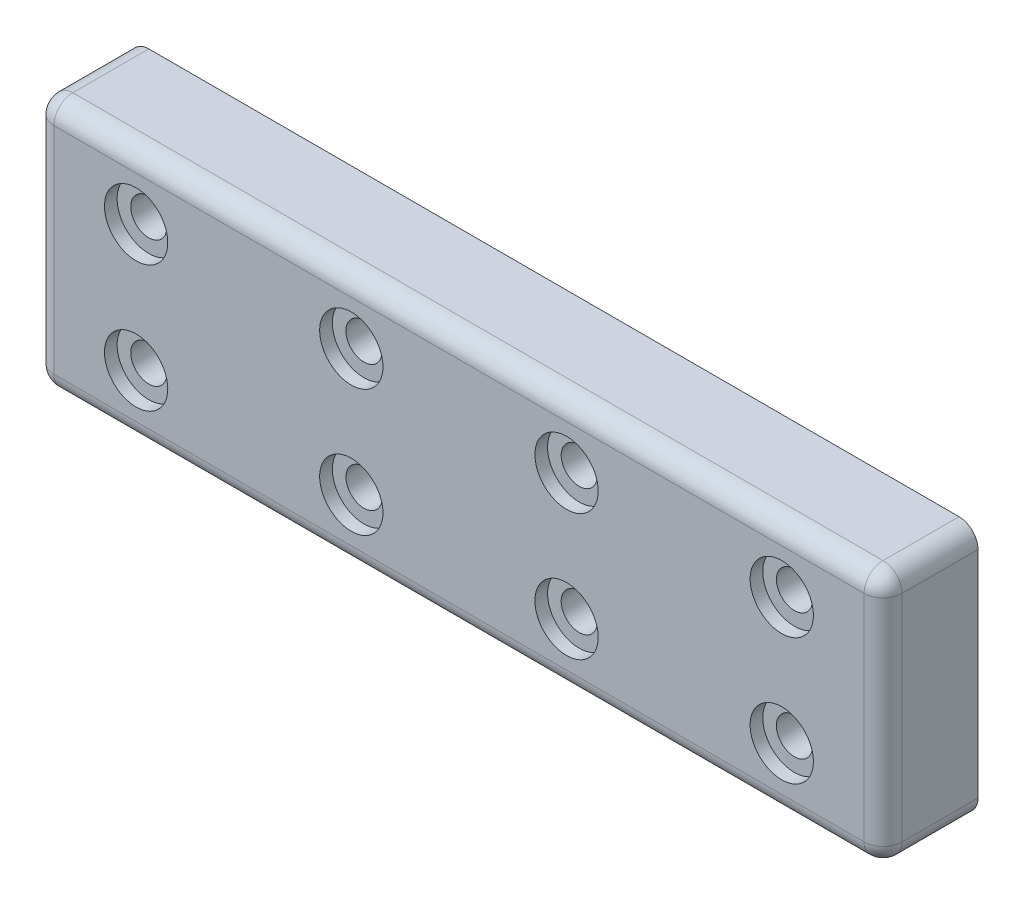
ISO-10303-21;
HEADER;
FILE_DESCRIPTION(('STEP AP214'),'2;1');
FILE_NAME('part.step','',(''),(''),'','','');
FILE_SCHEMA(('AUTOMOTIVE_DESIGN { 1 0 10303 214 1 1 1 1 }'));
ENDSEC;
DATA;
#1=APPLICATION_CONTEXT('core data for automotive mechanical design processes');
#2=APPLICATION_PROTOCOL_DEFINITION('international standard','automotive_design',2000,#1);
#3=PRODUCT_CONTEXT('',#1,'mechanical');
#4=PRODUCT('Part','Part','',(#3));
#5=PRODUCT_RELATED_PRODUCT_CATEGORY('part','',(#4));
#6=PRODUCT_DEFINITION_FORMATION('','',#4);
#7=PRODUCT_DEFINITION_CONTEXT('part definition',#1,'design');
#8=PRODUCT_DEFINITION('design','',#6,#7);
#9=PRODUCT_DEFINITION_SHAPE('','',#8);
#10=(LENGTH_UNIT() NAMED_UNIT(*) SI_UNIT(.MILLI.,.METRE.));
#11=(NAMED_UNIT(*) PLANE_ANGLE_UNIT() SI_UNIT($,.RADIAN.));
#12=(NAMED_UNIT(*) SI_UNIT($,.STERADIAN.) SOLID_ANGLE_UNIT());
#13=UNCERTAINTY_MEASURE_WITH_UNIT(LENGTH_MEASURE(1.E-05),#10,'distance_accuracy_value','');
#14=(GEOMETRIC_REPRESENTATION_CONTEXT(3) GLOBAL_UNCERTAINTY_ASSIGNED_CONTEXT((#13)) GLOBAL_UNIT_ASSIGNED_CONTEXT((#10,
#11,#12)) REPRESENTATION_CONTEXT('',''));
#15=CARTESIAN_POINT('',(0.,0.,0.));
#16=DIRECTION('',(0.,0.,1.));
#17=DIRECTION('',(1.,0.,0.));
#18=AXIS2_PLACEMENT_3D('',#15,#16,#17);
#19=CARTESIAN_POINT('',(-51.,10.,15.));
#20=DIRECTION('',(0.,0.,-1.));
#21=DIRECTION('',(-1.,0.,0.));
#22=AXIS2_PLACEMENT_3D('',#19,#20,#21);
#23=CYLINDRICAL_SURFACE('',#22,2.85);
#24=CARTESIAN_POINT('',(-51.,10.,0.));
#25=DIRECTION('',(0.,0.,1.));
#26=DIRECTION('',(1.,0.,0.));
#27=AXIS2_PLACEMENT_3D('',#24,#25,#26);
#28=CIRCLE('',#27,2.85);
#29=CARTESIAN_POINT('',(-48.15,10.,0.));
#30=VERTEX_POINT('',#29);
#31=EDGE_CURVE('E300',#30,#30,#28,.T.);
#32=ORIENTED_EDGE('',*,*,#31,.F.);
#33=EDGE_LOOP('',(#32));
#34=FACE_BOUND('',#33,.T.);
#35=CARTESIAN_POINT('',(-51.,10.,13.));
#36=DIRECTION('',(0.,0.,1.));
#37=DIRECTION('',(1.,0.,0.));
#38=AXIS2_PLACEMENT_3D('',#35,#36,#37);
#39=CIRCLE('',#38,2.85);
#40=CARTESIAN_POINT('',(-48.15,10.,13.));
#41=VERTEX_POINT('',#40);
#42=EDGE_CURVE('E172',#41,#41,#39,.T.);
#43=ORIENTED_EDGE('',*,*,#42,.T.);
#44=EDGE_LOOP('',(#43));
#45=FACE_BOUND('',#44,.T.);
#46=ADVANCED_FACE('F37',(#34,#45),#23,.F.);
#47=CARTESIAN_POINT('',(-17.,10.,15.));
#48=DIRECTION('',(0.,0.,-1.));
#49=DIRECTION('',(-1.,0.,0.));
#50=AXIS2_PLACEMENT_3D('',#47,#48,#49);
#51=CYLINDRICAL_SURFACE('',#50,2.85);
#52=CARTESIAN_POINT('',(-17.,10.,0.));
#53=DIRECTION('',(0.,0.,1.));
#54=DIRECTION('',(1.,0.,0.));
#55=AXIS2_PLACEMENT_3D('',#52,#53,#54);
#56=CIRCLE('',#55,2.85);
#57=CARTESIAN_POINT('',(-14.15,10.,0.));
#58=VERTEX_POINT('',#57);
#59=EDGE_CURVE('E297',#58,#58,#56,.T.);
#60=ORIENTED_EDGE('',*,*,#59,.F.);
#61=EDGE_LOOP('',(#60));
#62=FACE_BOUND('',#61,.T.);
#63=CARTESIAN_POINT('',(-17.,10.,13.));
#64=DIRECTION('',(0.,0.,1.));
#65=DIRECTION('',(1.,0.,0.));
#66=AXIS2_PLACEMENT_3D('',#63,#64,#65);
#67=CIRCLE('',#66,2.85);
#68=CARTESIAN_POINT('',(-14.15,10.,13.));
#69=VERTEX_POINT('',#68);
#70=EDGE_CURVE('E169',#69,#69,#67,.T.);
#71=ORIENTED_EDGE('',*,*,#70,.T.);
#72=EDGE_LOOP('',(#71));
#73=FACE_BOUND('',#72,.T.);
#74=ADVANCED_FACE('F340',(#62,#73),#51,.F.);
#75=CARTESIAN_POINT('',(17.,10.,15.));
#76=DIRECTION('',(0.,0.,-1.));
#77=DIRECTION('',(-1.,0.,0.));
#78=AXIS2_PLACEMENT_3D('',#75,#76,#77);
#79=CYLINDRICAL_SURFACE('',#78,2.85);
#80=CARTESIAN_POINT('',(17.,10.,0.));
#81=DIRECTION('',(0.,0.,1.));
#82=DIRECTION('',(1.,0.,0.));
#83=AXIS2_PLACEMENT_3D('',#80,#81,#82);
#84=CIRCLE('',#83,2.85);
#85=CARTESIAN_POINT('',(19.85,10.,0.));
#86=VERTEX_POINT('',#85);
#87=EDGE_CURVE('E294',#86,#86,#84,.T.);
#88=ORIENTED_EDGE('',*,*,#87,.F.);
#89=EDGE_LOOP('',(#88));
#90=FACE_BOUND('',#89,.T.);
#91=CARTESIAN_POINT('',(17.,10.,13.));
#92=DIRECTION('',(0.,0.,1.));
#93=DIRECTION('',(1.,0.,0.));
#94=AXIS2_PLACEMENT_3D('',#91,#92,#93);
#95=CIRCLE('',#94,2.85);
#96=CARTESIAN_POINT('',(19.85,10.,13.));
#97=VERTEX_POINT('',#96);
#98=EDGE_CURVE('E166',#97,#97,#95,.T.);
#99=ORIENTED_EDGE('',*,*,#98,.T.);
#100=EDGE_LOOP('',(#99));
#101=FACE_BOUND('',#100,.T.);
#102=ADVANCED_FACE('F346',(#90,#101),#79,.F.);
#103=CARTESIAN_POINT('',(51.,10.,15.));
#104=DIRECTION('',(0.,0.,-1.));
#105=DIRECTION('',(-1.,0.,0.));
#106=AXIS2_PLACEMENT_3D('',#103,#104,#105);
#107=CYLINDRICAL_SURFACE('',#106,2.85);
#108=CARTESIAN_POINT('',(51.,10.,0.));
#109=DIRECTION('',(0.,0.,1.));
#110=DIRECTION('',(1.,0.,0.));
#111=AXIS2_PLACEMENT_3D('',#108,#109,#110);
#112=CIRCLE('',#111,2.85);
#113=CARTESIAN_POINT('',(53.85,10.,0.));
#114=VERTEX_POINT('',#113);
#115=EDGE_CURVE('E291',#114,#114,#112,.T.);
#116=ORIENTED_EDGE('',*,*,#115,.F.);
#117=EDGE_LOOP('',(#116));
#118=FACE_BOUND('',#117,.T.);
#119=CARTESIAN_POINT('',(51.,10.,13.));
#120=DIRECTION('',(0.,0.,1.));
#121=DIRECTION('',(1.,0.,0.));
#122=AXIS2_PLACEMENT_3D('',#119,#120,#121);
#123=CIRCLE('',#122,2.85);
#124=CARTESIAN_POINT('',(53.85,10.,13.));
#125=VERTEX_POINT('',#124);
#126=EDGE_CURVE('E163',#125,#125,#123,.T.);
#127=ORIENTED_EDGE('',*,*,#126,.T.);
#128=EDGE_LOOP('',(#127));
#129=FACE_BOUND('',#128,.T.);
#130=ADVANCED_FACE('F719',(#118,#129),#107,.F.);
#131=CARTESIAN_POINT('',(-16.9999999999998,-10.,15.));
#132=DIRECTION('',(0.,0.,-1.));
#133=DIRECTION('',(-1.,0.,0.));
#134=AXIS2_PLACEMENT_3D('',#131,#132,#133);
#135=CYLINDRICAL_SURFACE('',#134,2.85);
#136=CARTESIAN_POINT('',(-16.9999999999998,-10.,0.));
#137=DIRECTION('',(0.,0.,1.));
#138=DIRECTION('',(1.,0.,0.));
#139=AXIS2_PLACEMENT_3D('',#136,#137,#138);
#140=CIRCLE('',#139,2.85);
#141=CARTESIAN_POINT('',(-14.1499999999998,-10.,0.));
#142=VERTEX_POINT('',#141);
#143=EDGE_CURVE('E288',#142,#142,#140,.T.);
#144=ORIENTED_EDGE('',*,*,#143,.F.);
#145=EDGE_LOOP('',(#144));
#146=FACE_BOUND('',#145,.T.);
#147=CARTESIAN_POINT('',(-16.9999999999998,-10.,13.));
#148=DIRECTION('',(0.,0.,1.));
#149=DIRECTION('',(1.,0.,0.));
#150=AXIS2_PLACEMENT_3D('',#147,#148,#149);
#151=CIRCLE('',#150,2.85);
#152=CARTESIAN_POINT('',(-14.1499999999998,-10.,13.));
#153=VERTEX_POINT('',#152);
#154=EDGE_CURVE('E160',#153,#153,#151,.T.);
#155=ORIENTED_EDGE('',*,*,#154,.T.);
#156=EDGE_LOOP('',(#155));
#157=FACE_BOUND('',#156,.T.);
#158=ADVANCED_FACE('F729',(#146,#157),#135,.F.);
#159=CARTESIAN_POINT('',(17.0000000000002,-10.,15.));
#160=DIRECTION('',(0.,0.,-1.));
#161=DIRECTION('',(-1.,0.,0.));
#162=AXIS2_PLACEMENT_3D('',#159,#160,#161);
#163=CYLINDRICAL_SURFACE('',#162,2.85);
#164=CARTESIAN_POINT('',(17.0000000000002,-10.,0.));
#165=DIRECTION('',(0.,0.,1.));
#166=DIRECTION('',(1.,0.,0.));
#167=AXIS2_PLACEMENT_3D('',#164,#165,#166);
#168=CIRCLE('',#167,2.85);
#169=CARTESIAN_POINT('',(19.8500000000002,-10.,0.));
#170=VERTEX_POINT('',#169);
#171=EDGE_CURVE('E285',#170,#170,#168,.T.);
#172=ORIENTED_EDGE('',*,*,#171,.F.);
#173=EDGE_LOOP('',(#172));
#174=FACE_BOUND('',#173,.T.);
#175=CARTESIAN_POINT('',(17.0000000000002,-10.,13.));
#176=DIRECTION('',(0.,0.,1.));
#177=DIRECTION('',(1.,0.,0.));
#178=AXIS2_PLACEMENT_3D('',#175,#176,#177);
#179=CIRCLE('',#178,2.85);
#180=CARTESIAN_POINT('',(19.8500000000002,-10.,13.));
#181=VERTEX_POINT('',#180);
#182=EDGE_CURVE('E157',#181,#181,#179,.T.);
#183=ORIENTED_EDGE('',*,*,#182,.T.);
#184=EDGE_LOOP('',(#183));
#185=FACE_BOUND('',#184,.T.);
#186=ADVANCED_FACE('F740',(#174,#185),#163,.F.);
#187=CARTESIAN_POINT('',(51.0000000000002,-10.,15.));
#188=DIRECTION('',(0.,0.,-1.));
#189=DIRECTION('',(-1.,0.,0.));
#190=AXIS2_PLACEMENT_3D('',#187,#188,#189);
#191=CYLINDRICAL_SURFACE('',#190,2.85);
#192=CARTESIAN_POINT('',(51.0000000000002,-10.,0.));
#193=DIRECTION('',(0.,0.,1.));
#194=DIRECTION('',(1.,0.,0.));
#195=AXIS2_PLACEMENT_3D('',#192,#193,#194);
#196=CIRCLE('',#195,2.85);
#197=CARTESIAN_POINT('',(53.8500000000002,-10.,0.));
#198=VERTEX_POINT('',#197);
#199=EDGE_CURVE('E282',#198,#198,#196,.T.);
#200=ORIENTED_EDGE('',*,*,#199,.F.);
#201=EDGE_LOOP('',(#200));
#202=FACE_BOUND('',#201,.T.);
#203=CARTESIAN_POINT('',(51.0000000000002,-10.,13.));
#204=DIRECTION('',(0.,0.,1.));
#205=DIRECTION('',(1.,0.,0.));
#206=AXIS2_PLACEMENT_3D('',#203,#204,#205);
#207=CIRCLE('',#206,2.85);
#208=CARTESIAN_POINT('',(53.8500000000002,-10.,13.));
#209=VERTEX_POINT('',#208);
#210=EDGE_CURVE('E153',#209,#209,#207,.T.);
#211=ORIENTED_EDGE('',*,*,#210,.T.);
#212=EDGE_LOOP('',(#211));
#213=FACE_BOUND('',#212,.T.);
#214=ADVANCED_FACE('F751',(#202,#213),#191,.F.);
#215=CARTESIAN_POINT('',(-50.9999999999998,-10.,15.));
#216=DIRECTION('',(0.,0.,-1.));
#217=DIRECTION('',(-1.,0.,0.));
#218=AXIS2_PLACEMENT_3D('',#215,#216,#217);
#219=CYLINDRICAL_SURFACE('',#218,2.85);
#220=CARTESIAN_POINT('',(-50.9999999999998,-10.,0.));
#221=DIRECTION('',(0.,0.,1.));
#222=DIRECTION('',(1.,0.,0.));
#223=AXIS2_PLACEMENT_3D('',#220,#221,#222);
#224=CIRCLE('',#223,2.85);
#225=CARTESIAN_POINT('',(-48.1499999999998,-10.,0.));
#226=VERTEX_POINT('',#225);
#227=EDGE_CURVE('E175',#226,#226,#224,.T.);
#228=ORIENTED_EDGE('',*,*,#227,.F.);
#229=EDGE_LOOP('',(#228));
#230=FACE_BOUND('',#229,.T.);
#231=CARTESIAN_POINT('',(-50.9999999999998,-10.,13.));
#232=DIRECTION('',(0.,0.,1.));
#233=DIRECTION('',(1.,0.,0.));
#234=AXIS2_PLACEMENT_3D('',#231,#232,#233);
#235=CIRCLE('',#234,2.85);
#236=CARTESIAN_POINT('',(-48.1499999999998,-10.,13.));
#237=VERTEX_POINT('',#236);
#238=EDGE_CURVE('E150',#237,#237,#235,.T.);
#239=ORIENTED_EDGE('',*,*,#238,.T.);
#240=EDGE_LOOP('',(#239));
#241=FACE_BOUND('',#240,.T.);
#242=ADVANCED_FACE('F355',(#230,#241),#219,.F.);
#243=CARTESIAN_POINT('',(0.,0.,15.));
#244=DIRECTION('',(0.,0.,-1.));
#245=DIRECTION('',(-1.,0.,0.));
#246=AXIS2_PLACEMENT_3D('',#243,#244,#245);
#247=PLANE('',#246);
#248=DIRECTION('',(1.,0.,0.));
#249=VECTOR('',#248,1.);
#250=CARTESIAN_POINT('',(0.,-17.,15.));
#251=LINE('',#250,#249);
#252=CARTESIAN_POINT('',(-64.,-17.,15.));
#253=VERTEX_POINT('',#252);
#254=CARTESIAN_POINT('',(64.,-17.,15.));
#255=VERTEX_POINT('',#254);
#256=EDGE_CURVE('E46',#253,#255,#251,.T.);
#257=ORIENTED_EDGE('',*,*,#256,.T.);
#258=DIRECTION('',(0.,1.,0.));
#259=VECTOR('',#258,1.);
#260=CARTESIAN_POINT('',(64.,0.,15.));
#261=LINE('',#260,#259);
#262=CARTESIAN_POINT('',(64.,17.,15.));
#263=VERTEX_POINT('',#262);
#264=EDGE_CURVE('E11',#255,#263,#261,.T.);
#265=ORIENTED_EDGE('',*,*,#264,.T.);
#266=DIRECTION('',(-1.,0.,0.));
#267=VECTOR('',#266,1.);
#268=CARTESIAN_POINT('',(0.,17.,15.));
#269=LINE('',#268,#267);
#270=CARTESIAN_POINT('',(-64.,17.,15.));
#271=VERTEX_POINT('',#270);
#272=EDGE_CURVE('E198',#263,#271,#269,.T.);
#273=ORIENTED_EDGE('',*,*,#272,.T.);
#274=DIRECTION('',(0.,-1.,0.));
#275=VECTOR('',#274,1.);
#276=CARTESIAN_POINT('',(-64.,0.,15.));
#277=LINE('',#276,#275);
#278=EDGE_CURVE('E57',#271,#253,#277,.T.);
#279=ORIENTED_EDGE('',*,*,#278,.T.);
#280=EDGE_LOOP('',(#257,#265,#273,#279));
#281=FACE_BOUND('',#280,.T.);
#282=CARTESIAN_POINT('',(-16.9999999999998,-10.,15.));
#283=DIRECTION('',(0.,0.,1.));
#284=DIRECTION('',(1.,0.,0.));
#285=AXIS2_PLACEMENT_3D('',#282,#283,#284);
#286=CIRCLE('',#285,5.);
#287=CARTESIAN_POINT('',(-11.9999999999998,-10.,15.));
#288=VERTEX_POINT('',#287);
#289=EDGE_CURVE('E257',#288,#288,#286,.T.);
#290=ORIENTED_EDGE('',*,*,#289,.F.);
#291=EDGE_LOOP('',(#290));
#292=FACE_BOUND('',#291,.T.);
#293=CARTESIAN_POINT('',(51.,10.,15.));
#294=DIRECTION('',(0.,0.,1.));
#295=DIRECTION('',(1.,0.,0.));
#296=AXIS2_PLACEMENT_3D('',#293,#294,#295);
#297=CIRCLE('',#296,5.);
#298=CARTESIAN_POINT('',(56.,10.,15.));
#299=VERTEX_POINT('',#298);
#300=EDGE_CURVE('E250',#299,#299,#297,.T.);
#301=ORIENTED_EDGE('',*,*,#300,.F.);
#302=EDGE_LOOP('',(#301));
#303=FACE_BOUND('',#302,.T.);
#304=CARTESIAN_POINT('',(17.,10.,15.));
#305=DIRECTION('',(0.,0.,1.));
#306=DIRECTION('',(1.,0.,0.));
#307=AXIS2_PLACEMENT_3D('',#304,#305,#306);
#308=CIRCLE('',#307,5.);
#309=CARTESIAN_POINT('',(22.,10.,15.));
#310=VERTEX_POINT('',#309);
#311=EDGE_CURVE('E271',#310,#310,#308,.T.);
#312=ORIENTED_EDGE('',*,*,#311,.F.);
#313=EDGE_LOOP('',(#312));
#314=FACE_BOUND('',#313,.T.);
#315=CARTESIAN_POINT('',(-17.,10.,15.));
#316=DIRECTION('',(0.,0.,1.));
#317=DIRECTION('',(1.,0.,0.));
#318=AXIS2_PLACEMENT_3D('',#315,#316,#317);
#319=CIRCLE('',#318,5.);
#320=CARTESIAN_POINT('',(-12.,10.,15.));
#321=VERTEX_POINT('',#320);
#322=EDGE_CURVE('E264',#321,#321,#319,.T.);
#323=ORIENTED_EDGE('',*,*,#322,.F.);
#324=EDGE_LOOP('',(#323));
#325=FACE_BOUND('',#324,.T.);
#326=CARTESIAN_POINT('',(17.0000000000002,-10.,15.));
#327=DIRECTION('',(0.,0.,1.));
#328=DIRECTION('',(1.,0.,0.));
#329=AXIS2_PLACEMENT_3D('',#326,#327,#328);
#330=CIRCLE('',#329,5.);
#331=CARTESIAN_POINT('',(22.0000000000002,-10.,15.));
#332=VERTEX_POINT('',#331);
#333=EDGE_CURVE('E263',#332,#332,#330,.T.);
#334=ORIENTED_EDGE('',*,*,#333,.F.);
#335=EDGE_LOOP('',(#334));
#336=FACE_BOUND('',#335,.T.);
#337=CARTESIAN_POINT('',(51.0000000000002,-10.,15.));
#338=DIRECTION('',(0.,0.,1.));
#339=DIRECTION('',(1.,0.,0.));
#340=AXIS2_PLACEMENT_3D('',#337,#338,#339);
#341=CIRCLE('',#340,5.);
#342=CARTESIAN_POINT('',(56.0000000000002,-10.,15.));
#343=VERTEX_POINT('',#342);
#344=EDGE_CURVE('E821',#343,#343,#341,.T.);
#345=ORIENTED_EDGE('',*,*,#344,.F.);
#346=EDGE_LOOP('',(#345));
#347=FACE_BOUND('',#346,.T.);
#348=CARTESIAN_POINT('',(-50.9999999999998,-10.,15.));
#349=DIRECTION('',(0.,0.,1.));
#350=DIRECTION('',(1.,0.,0.));
#351=AXIS2_PLACEMENT_3D('',#348,#349,#350);
#352=CIRCLE('',#351,5.);
#353=CARTESIAN_POINT('',(-45.9999999999998,-10.,15.));
#354=VERTEX_POINT('',#353);
#355=EDGE_CURVE('E241',#354,#354,#352,.T.);
#356=ORIENTED_EDGE('',*,*,#355,.F.);
#357=EDGE_LOOP('',(#356));
#358=FACE_BOUND('',#357,.T.);
#359=CARTESIAN_POINT('',(-51.,10.,15.));
#360=DIRECTION('',(0.,0.,1.));
#361=DIRECTION('',(1.,0.,0.));
#362=AXIS2_PLACEMENT_3D('',#359,#360,#361);
#363=CIRCLE('',#362,5.);
#364=CARTESIAN_POINT('',(-46.,10.,15.));
#365=VERTEX_POINT('',#364);
#366=EDGE_CURVE('E267',#365,#365,#363,.T.);
#367=ORIENTED_EDGE('',*,*,#366,.F.);
#368=EDGE_LOOP('',(#367));
#369=FACE_BOUND('',#368,.T.);
#370=ADVANCED_FACE('F319',(#281,#292,#303,#314,#325,#336,#347,#358,#369),#247,.F.);
#371=CARTESIAN_POINT('',(0.,0.,0.));
#372=DIRECTION('',(0.,0.,-1.));
#373=DIRECTION('',(-1.,0.,0.));
#374=AXIS2_PLACEMENT_3D('',#371,#372,#373);
#375=PLANE('',#374);
#376=ORIENTED_EDGE('',*,*,#199,.T.);
#377=EDGE_LOOP('',(#376));
#378=FACE_BOUND('',#377,.T.);
#379=ORIENTED_EDGE('',*,*,#143,.T.);
#380=EDGE_LOOP('',(#379));
#381=FACE_BOUND('',#380,.T.);
#382=ORIENTED_EDGE('',*,*,#87,.T.);
#383=EDGE_LOOP('',(#382));
#384=FACE_BOUND('',#383,.T.);
#385=ORIENTED_EDGE('',*,*,#31,.T.);
#386=EDGE_LOOP('',(#385));
#387=FACE_BOUND('',#386,.T.);
#388=DIRECTION('',(0.,-1.,0.));
#389=VECTOR('',#388,1.);
#390=CARTESIAN_POINT('',(-67.,-20.,0.));
#391=LINE('',#390,#389);
#392=CARTESIAN_POINT('',(-67.,17.,0.));
#393=VERTEX_POINT('',#392);
#394=CARTESIAN_POINT('',(-67.,-17.,0.));
#395=VERTEX_POINT('',#394);
#396=EDGE_CURVE('E129',#393,#395,#391,.T.);
#397=ORIENTED_EDGE('',*,*,#396,.F.);
#398=CARTESIAN_POINT('',(-64.,17.,0.));
#399=DIRECTION('',(0.,0.,-1.));
#400=DIRECTION('',(-1.,0.,0.));
#401=AXIS2_PLACEMENT_3D('',#398,#399,#400);
#402=CIRCLE('',#401,3.);
#403=CARTESIAN_POINT('',(-64.,20.,0.));
#404=VERTEX_POINT('',#403);
#405=EDGE_CURVE('E113',#393,#404,#402,.T.);
#406=ORIENTED_EDGE('',*,*,#405,.T.);
#407=DIRECTION('',(-1.,0.,0.));
#408=VECTOR('',#407,1.);
#409=CARTESIAN_POINT('',(-67.,20.,0.));
#410=LINE('',#409,#408);
#411=CARTESIAN_POINT('',(64.,20.,0.));
#412=VERTEX_POINT('',#411);
#413=EDGE_CURVE('E142',#412,#404,#410,.T.);
#414=ORIENTED_EDGE('',*,*,#413,.F.);
#415=CARTESIAN_POINT('',(64.,17.,0.));
#416=DIRECTION('',(0.,0.,-1.));
#417=DIRECTION('',(-1.,0.,0.));
#418=AXIS2_PLACEMENT_3D('',#415,#416,#417);
#419=CIRCLE('',#418,3.);
#420=CARTESIAN_POINT('',(67.,17.,0.));
#421=VERTEX_POINT('',#420);
#422=EDGE_CURVE('E134',#412,#421,#419,.T.);
#423=ORIENTED_EDGE('',*,*,#422,.T.);
#424=DIRECTION('',(0.,1.,0.));
#425=VECTOR('',#424,1.);
#426=CARTESIAN_POINT('',(67.,-20.,0.));
#427=LINE('',#426,#425);
#428=CARTESIAN_POINT('',(67.,-17.,0.));
#429=VERTEX_POINT('',#428);
#430=EDGE_CURVE('E146',#429,#421,#427,.T.);
#431=ORIENTED_EDGE('',*,*,#430,.F.);
#432=CARTESIAN_POINT('',(64.,-17.,0.));
#433=DIRECTION('',(0.,0.,-1.));
#434=DIRECTION('',(-1.,0.,0.));
#435=AXIS2_PLACEMENT_3D('',#432,#433,#434);
#436=CIRCLE('',#435,3.);
#437=CARTESIAN_POINT('',(64.,-20.,0.));
#438=VERTEX_POINT('',#437);
#439=EDGE_CURVE('E179',#429,#438,#436,.T.);
#440=ORIENTED_EDGE('',*,*,#439,.T.);
#441=DIRECTION('',(1.,0.,0.));
#442=VECTOR('',#441,1.);
#443=CARTESIAN_POINT('',(-67.,-20.,0.));
#444=LINE('',#443,#442);
#445=CARTESIAN_POINT('',(-64.,-20.,0.));
#446=VERTEX_POINT('',#445);
#447=EDGE_CURVE('E141',#446,#438,#444,.T.);
#448=ORIENTED_EDGE('',*,*,#447,.F.);
#449=CARTESIAN_POINT('',(-64.,-17.,0.));
#450=DIRECTION('',(0.,0.,-1.));
#451=DIRECTION('',(-1.,0.,0.));
#452=AXIS2_PLACEMENT_3D('',#449,#450,#451);
#453=CIRCLE('',#452,3.);
#454=EDGE_CURVE('E124',#446,#395,#453,.T.);
#455=ORIENTED_EDGE('',*,*,#454,.T.);
#456=EDGE_LOOP('',(#397,#406,#414,#423,#431,#440,#448,#455));
#457=FACE_BOUND('',#456,.T.);
#458=ORIENTED_EDGE('',*,*,#59,.T.);
#459=EDGE_LOOP('',(#458));
#460=FACE_BOUND('',#459,.T.);
#461=ORIENTED_EDGE('',*,*,#115,.T.);
#462=EDGE_LOOP('',(#461));
#463=FACE_BOUND('',#462,.T.);
#464=ORIENTED_EDGE('',*,*,#171,.T.);
#465=EDGE_LOOP('',(#464));
#466=FACE_BOUND('',#465,.T.);
#467=ORIENTED_EDGE('',*,*,#227,.T.);
#468=EDGE_LOOP('',(#467));
#469=FACE_BOUND('',#468,.T.);
#470=ADVANCED_FACE('F137',(#378,#381,#384,#387,#457,#460,#463,#466,#469),#375,.T.);
#471=CARTESIAN_POINT('',(67.,-20.,15.));
#472=DIRECTION('',(-1.,0.,0.));
#473=DIRECTION('',(0.,0.,1.));
#474=AXIS2_PLACEMENT_3D('',#471,#472,#473);
#475=PLANE('',#474);
#476=DIRECTION('',(0.,1.,0.));
#477=VECTOR('',#476,1.);
#478=CARTESIAN_POINT('',(67.,-20.,12.));
#479=LINE('',#478,#477);
#480=CARTESIAN_POINT('',(67.,17.,12.));
#481=VERTEX_POINT('',#480);
#482=CARTESIAN_POINT('',(67.,-17.,12.));
#483=VERTEX_POINT('',#482);
#484=EDGE_CURVE('E192',#481,#483,#479,.F.);
#485=ORIENTED_EDGE('',*,*,#484,.T.);
#486=DIRECTION('',(0.,0.,-1.));
#487=VECTOR('',#486,1.);
#488=CARTESIAN_POINT('',(67.,-17.,15.));
#489=LINE('',#488,#487);
#490=EDGE_CURVE('E196',#483,#429,#489,.T.);
#491=ORIENTED_EDGE('',*,*,#490,.T.);
#492=ORIENTED_EDGE('',*,*,#430,.T.);
#493=DIRECTION('',(0.,0.,-1.));
#494=VECTOR('',#493,1.);
#495=CARTESIAN_POINT('',(67.,17.,15.));
#496=LINE('',#495,#494);
#497=EDGE_CURVE('E194',#421,#481,#496,.F.);
#498=ORIENTED_EDGE('',*,*,#497,.T.);
#499=EDGE_LOOP('',(#485,#491,#492,#498));
#500=FACE_BOUND('',#499,.T.);
#501=ADVANCED_FACE('F306',(#500),#475,.F.);
#502=CARTESIAN_POINT('',(-67.,20.,15.));
#503=DIRECTION('',(0.,-1.,0.));
#504=DIRECTION('',(0.,0.,-1.));
#505=AXIS2_PLACEMENT_3D('',#502,#503,#504);
#506=PLANE('',#505);
#507=ORIENTED_EDGE('',*,*,#413,.T.);
#508=DIRECTION('',(0.,0.,-1.));
#509=VECTOR('',#508,1.);
#510=CARTESIAN_POINT('',(-64.,20.,15.));
#511=LINE('',#510,#509);
#512=CARTESIAN_POINT('',(-64.,20.,12.));
#513=VERTEX_POINT('',#512);
#514=EDGE_CURVE('E118',#404,#513,#511,.F.);
#515=ORIENTED_EDGE('',*,*,#514,.T.);
#516=DIRECTION('',(-1.,0.,0.));
#517=VECTOR('',#516,1.);
#518=CARTESIAN_POINT('',(-67.,20.,12.));
#519=LINE('',#518,#517);
#520=CARTESIAN_POINT('',(64.,20.,12.));
#521=VERTEX_POINT('',#520);
#522=EDGE_CURVE('E123',#513,#521,#519,.F.);
#523=ORIENTED_EDGE('',*,*,#522,.T.);
#524=DIRECTION('',(0.,0.,-1.));
#525=VECTOR('',#524,1.);
#526=CARTESIAN_POINT('',(64.,20.,15.));
#527=LINE('',#526,#525);
#528=EDGE_CURVE('E183',#521,#412,#527,.T.);
#529=ORIENTED_EDGE('',*,*,#528,.T.);
#530=EDGE_LOOP('',(#507,#515,#523,#529));
#531=FACE_BOUND('',#530,.T.);
#532=ADVANCED_FACE('F366',(#531),#506,.F.);
#533=CARTESIAN_POINT('',(-67.,-20.,15.));
#534=DIRECTION('',(1.,0.,0.));
#535=DIRECTION('',(0.,0.,-1.));
#536=AXIS2_PLACEMENT_3D('',#533,#534,#535);
#537=PLANE('',#536);
#538=DIRECTION('',(0.,-1.,0.));
#539=VECTOR('',#538,1.);
#540=CARTESIAN_POINT('',(-67.,-20.,12.));
#541=LINE('',#540,#539);
#542=CARTESIAN_POINT('',(-67.,-17.,12.));
#543=VERTEX_POINT('',#542);
#544=CARTESIAN_POINT('',(-67.,17.,12.));
#545=VERTEX_POINT('',#544);
#546=EDGE_CURVE('E132',#543,#545,#541,.F.);
#547=ORIENTED_EDGE('',*,*,#546,.T.);
#548=DIRECTION('',(0.,0.,-1.));
#549=VECTOR('',#548,1.);
#550=CARTESIAN_POINT('',(-67.,17.,15.));
#551=LINE('',#550,#549);
#552=EDGE_CURVE('E117',#545,#393,#551,.T.);
#553=ORIENTED_EDGE('',*,*,#552,.T.);
#554=ORIENTED_EDGE('',*,*,#396,.T.);
#555=DIRECTION('',(0.,0.,-1.));
#556=VECTOR('',#555,1.);
#557=CARTESIAN_POINT('',(-67.,-17.,15.));
#558=LINE('',#557,#556);
#559=EDGE_CURVE('E135',#395,#543,#558,.F.);
#560=ORIENTED_EDGE('',*,*,#559,.T.);
#561=EDGE_LOOP('',(#547,#553,#554,#560));
#562=FACE_BOUND('',#561,.T.);
#563=ADVANCED_FACE('F128',(#562),#537,.F.);
#564=CARTESIAN_POINT('',(-67.,-20.,15.));
#565=DIRECTION('',(0.,1.,0.));
#566=DIRECTION('',(0.,0.,1.));
#567=AXIS2_PLACEMENT_3D('',#564,#565,#566);
#568=PLANE('',#567);
#569=DIRECTION('',(1.,0.,0.));
#570=VECTOR('',#569,1.);
#571=CARTESIAN_POINT('',(-67.,-20.,12.));
#572=LINE('',#571,#570);
#573=CARTESIAN_POINT('',(64.,-20.,12.));
#574=VERTEX_POINT('',#573);
#575=CARTESIAN_POINT('',(-64.,-20.,12.));
#576=VERTEX_POINT('',#575);
#577=EDGE_CURVE('E186',#574,#576,#572,.F.);
#578=ORIENTED_EDGE('',*,*,#577,.T.);
#579=DIRECTION('',(0.,0.,-1.));
#580=VECTOR('',#579,1.);
#581=CARTESIAN_POINT('',(-64.,-20.,15.));
#582=LINE('',#581,#580);
#583=EDGE_CURVE('E190',#576,#446,#582,.T.);
#584=ORIENTED_EDGE('',*,*,#583,.T.);
#585=ORIENTED_EDGE('',*,*,#447,.T.);
#586=DIRECTION('',(0.,0.,-1.));
#587=VECTOR('',#586,1.);
#588=CARTESIAN_POINT('',(64.,-20.,15.));
#589=LINE('',#588,#587);
#590=EDGE_CURVE('E188',#438,#574,#589,.F.);
#591=ORIENTED_EDGE('',*,*,#590,.T.);
#592=EDGE_LOOP('',(#578,#584,#585,#591));
#593=FACE_BOUND('',#592,.T.);
#594=ADVANCED_FACE('F359',(#593),#568,.F.);
#595=CARTESIAN_POINT('',(-50.9999999999998,-10.,13.));
#596=DIRECTION('',(0.,0.,1.));
#597=DIRECTION('',(1.,0.,0.));
#598=AXIS2_PLACEMENT_3D('',#595,#596,#597);
#599=CYLINDRICAL_SURFACE('',#598,5.);
#600=CARTESIAN_POINT('',(-50.9999999999998,-10.,13.));
#601=DIRECTION('',(0.,0.,1.));
#602=DIRECTION('',(1.,0.,0.));
#603=AXIS2_PLACEMENT_3D('',#600,#601,#602);
#604=CIRCLE('',#603,5.);
#605=CARTESIAN_POINT('',(-45.9999999999998,-10.,13.));
#606=VERTEX_POINT('',#605);
#607=EDGE_CURVE('E236',#606,#606,#604,.T.);
#608=ORIENTED_EDGE('',*,*,#607,.F.);
#609=EDGE_LOOP('',(#608));
#610=FACE_BOUND('',#609,.T.);
#611=ORIENTED_EDGE('',*,*,#355,.T.);
#612=EDGE_LOOP('',(#611));
#613=FACE_BOUND('',#612,.T.);
#614=ADVANCED_FACE('F362',(#610,#613),#599,.F.);
#615=CARTESIAN_POINT('',(-50.9999999999998,-10.,13.));
#616=DIRECTION('',(0.,0.,1.));
#617=DIRECTION('',(1.,0.,0.));
#618=AXIS2_PLACEMENT_3D('',#615,#616,#617);
#619=PLANE('',#618);
#620=ORIENTED_EDGE('',*,*,#238,.F.);
#621=EDGE_LOOP('',(#620));
#622=FACE_BOUND('',#621,.T.);
#623=ORIENTED_EDGE('',*,*,#607,.T.);
#624=EDGE_LOOP('',(#623));
#625=FACE_BOUND('',#624,.T.);
#626=ADVANCED_FACE('F394',(#622,#625),#619,.T.);
#627=CARTESIAN_POINT('',(51.0000000000002,-10.,13.));
#628=DIRECTION('',(0.,0.,1.));
#629=DIRECTION('',(1.,0.,0.));
#630=AXIS2_PLACEMENT_3D('',#627,#628,#629);
#631=CYLINDRICAL_SURFACE('',#630,5.);
#632=CARTESIAN_POINT('',(51.0000000000002,-10.,13.));
#633=DIRECTION('',(0.,0.,1.));
#634=DIRECTION('',(1.,0.,0.));
#635=AXIS2_PLACEMENT_3D('',#632,#633,#634);
#636=CIRCLE('',#635,5.);
#637=CARTESIAN_POINT('',(56.0000000000002,-10.,13.));
#638=VERTEX_POINT('',#637);
#639=EDGE_CURVE('E246',#638,#638,#636,.T.);
#640=ORIENTED_EDGE('',*,*,#639,.F.);
#641=EDGE_LOOP('',(#640));
#642=FACE_BOUND('',#641,.T.);
#643=ORIENTED_EDGE('',*,*,#344,.T.);
#644=EDGE_LOOP('',(#643));
#645=FACE_BOUND('',#644,.T.);
#646=ADVANCED_FACE('F403',(#642,#645),#631,.F.);
#647=CARTESIAN_POINT('',(51.0000000000002,-10.,13.));
#648=DIRECTION('',(0.,0.,1.));
#649=DIRECTION('',(1.,0.,0.));
#650=AXIS2_PLACEMENT_3D('',#647,#648,#649);
#651=PLANE('',#650);
#652=ORIENTED_EDGE('',*,*,#210,.F.);
#653=EDGE_LOOP('',(#652));
#654=FACE_BOUND('',#653,.T.);
#655=ORIENTED_EDGE('',*,*,#639,.T.);
#656=EDGE_LOOP('',(#655));
#657=FACE_BOUND('',#656,.T.);
#658=ADVANCED_FACE('F411',(#654,#657),#651,.T.);
#659=CARTESIAN_POINT('',(17.0000000000002,-10.,13.));
#660=DIRECTION('',(0.,0.,1.));
#661=DIRECTION('',(1.,0.,0.));
#662=AXIS2_PLACEMENT_3D('',#659,#660,#661);
#663=CYLINDRICAL_SURFACE('',#662,5.);
#664=CARTESIAN_POINT('',(17.0000000000002,-10.,13.));
#665=DIRECTION('',(0.,0.,1.));
#666=DIRECTION('',(1.,0.,0.));
#667=AXIS2_PLACEMENT_3D('',#664,#665,#666);
#668=CIRCLE('',#667,5.);
#669=CARTESIAN_POINT('',(22.0000000000002,-10.,13.));
#670=VERTEX_POINT('',#669);
#671=EDGE_CURVE('E823',#670,#670,#668,.T.);
#672=ORIENTED_EDGE('',*,*,#671,.F.);
#673=EDGE_LOOP('',(#672));
#674=FACE_BOUND('',#673,.T.);
#675=ORIENTED_EDGE('',*,*,#333,.T.);
#676=EDGE_LOOP('',(#675));
#677=FACE_BOUND('',#676,.T.);
#678=ADVANCED_FACE('F419',(#674,#677),#663,.F.);
#679=CARTESIAN_POINT('',(17.0000000000002,-10.,13.));
#680=DIRECTION('',(0.,0.,1.));
#681=DIRECTION('',(1.,0.,0.));
#682=AXIS2_PLACEMENT_3D('',#679,#680,#681);
#683=PLANE('',#682);
#684=ORIENTED_EDGE('',*,*,#182,.F.);
#685=EDGE_LOOP('',(#684));
#686=FACE_BOUND('',#685,.T.);
#687=ORIENTED_EDGE('',*,*,#671,.T.);
#688=EDGE_LOOP('',(#687));
#689=FACE_BOUND('',#688,.T.);
#690=ADVANCED_FACE('F427',(#686,#689),#683,.T.);
#691=CARTESIAN_POINT('',(-16.9999999999998,-10.,13.));
#692=DIRECTION('',(0.,0.,1.));
#693=DIRECTION('',(1.,0.,0.));
#694=AXIS2_PLACEMENT_3D('',#691,#692,#693);
#695=CYLINDRICAL_SURFACE('',#694,5.);
#696=CARTESIAN_POINT('',(-16.9999999999998,-10.,13.));
#697=DIRECTION('',(0.,0.,1.));
#698=DIRECTION('',(1.,0.,0.));
#699=AXIS2_PLACEMENT_3D('',#696,#697,#698);
#700=CIRCLE('',#699,5.);
#701=CARTESIAN_POINT('',(-11.9999999999998,-10.,13.));
#702=VERTEX_POINT('',#701);
#703=EDGE_CURVE('E260',#702,#702,#700,.T.);
#704=ORIENTED_EDGE('',*,*,#703,.F.);
#705=EDGE_LOOP('',(#704));
#706=FACE_BOUND('',#705,.T.);
#707=ORIENTED_EDGE('',*,*,#289,.T.);
#708=EDGE_LOOP('',(#707));
#709=FACE_BOUND('',#708,.T.);
#710=ADVANCED_FACE('F435',(#706,#709),#695,.F.);
#711=CARTESIAN_POINT('',(-16.9999999999998,-10.,13.));
#712=DIRECTION('',(0.,0.,1.));
#713=DIRECTION('',(1.,0.,0.));
#714=AXIS2_PLACEMENT_3D('',#711,#712,#713);
#715=PLANE('',#714);
#716=ORIENTED_EDGE('',*,*,#154,.F.);
#717=EDGE_LOOP('',(#716));
#718=FACE_BOUND('',#717,.T.);
#719=ORIENTED_EDGE('',*,*,#703,.T.);
#720=EDGE_LOOP('',(#719));
#721=FACE_BOUND('',#720,.T.);
#722=ADVANCED_FACE('F443',(#718,#721),#715,.T.);
#723=CARTESIAN_POINT('',(51.,10.,13.));
#724=DIRECTION('',(0.,0.,1.));
#725=DIRECTION('',(1.,0.,0.));
#726=AXIS2_PLACEMENT_3D('',#723,#724,#725);
#727=CYLINDRICAL_SURFACE('',#726,5.);
#728=CARTESIAN_POINT('',(51.,10.,13.));
#729=DIRECTION('',(0.,0.,1.));
#730=DIRECTION('',(1.,0.,0.));
#731=AXIS2_PLACEMENT_3D('',#728,#729,#730);
#732=CIRCLE('',#731,5.);
#733=CARTESIAN_POINT('',(56.,10.,13.));
#734=VERTEX_POINT('',#733);
#735=EDGE_CURVE('E254',#734,#734,#732,.T.);
#736=ORIENTED_EDGE('',*,*,#735,.F.);
#737=EDGE_LOOP('',(#736));
#738=FACE_BOUND('',#737,.T.);
#739=ORIENTED_EDGE('',*,*,#300,.T.);
#740=EDGE_LOOP('',(#739));
#741=FACE_BOUND('',#740,.T.);
#742=ADVANCED_FACE('F451',(#738,#741),#727,.F.);
#743=CARTESIAN_POINT('',(51.,10.,13.));
#744=DIRECTION('',(0.,0.,1.));
#745=DIRECTION('',(1.,0.,0.));
#746=AXIS2_PLACEMENT_3D('',#743,#744,#745);
#747=PLANE('',#746);
#748=ORIENTED_EDGE('',*,*,#126,.F.);
#749=EDGE_LOOP('',(#748));
#750=FACE_BOUND('',#749,.T.);
#751=ORIENTED_EDGE('',*,*,#735,.T.);
#752=EDGE_LOOP('',(#751));
#753=FACE_BOUND('',#752,.T.);
#754=ADVANCED_FACE('F459',(#750,#753),#747,.T.);
#755=CARTESIAN_POINT('',(17.,10.,13.));
#756=DIRECTION('',(0.,0.,1.));
#757=DIRECTION('',(1.,0.,0.));
#758=AXIS2_PLACEMENT_3D('',#755,#756,#757);
#759=CYLINDRICAL_SURFACE('',#758,5.);
#760=CARTESIAN_POINT('',(17.,10.,13.));
#761=DIRECTION('',(0.,0.,1.));
#762=DIRECTION('',(1.,0.,0.));
#763=AXIS2_PLACEMENT_3D('',#760,#761,#762);
#764=CIRCLE('',#763,5.);
#765=CARTESIAN_POINT('',(22.,10.,13.));
#766=VERTEX_POINT('',#765);
#767=EDGE_CURVE('E253',#766,#766,#764,.T.);
#768=ORIENTED_EDGE('',*,*,#767,.F.);
#769=EDGE_LOOP('',(#768));
#770=FACE_BOUND('',#769,.T.);
#771=ORIENTED_EDGE('',*,*,#311,.T.);
#772=EDGE_LOOP('',(#771));
#773=FACE_BOUND('',#772,.T.);
#774=ADVANCED_FACE('F467',(#770,#773),#759,.F.);
#775=CARTESIAN_POINT('',(17.,10.,13.));
#776=DIRECTION('',(0.,0.,1.));
#777=DIRECTION('',(1.,0.,0.));
#778=AXIS2_PLACEMENT_3D('',#775,#776,#777);
#779=PLANE('',#778);
#780=ORIENTED_EDGE('',*,*,#98,.F.);
#781=EDGE_LOOP('',(#780));
#782=FACE_BOUND('',#781,.T.);
#783=ORIENTED_EDGE('',*,*,#767,.T.);
#784=EDGE_LOOP('',(#783));
#785=FACE_BOUND('',#784,.T.);
#786=ADVANCED_FACE('F475',(#782,#785),#779,.T.);
#787=CARTESIAN_POINT('',(-17.,10.,13.));
#788=DIRECTION('',(0.,0.,1.));
#789=DIRECTION('',(1.,0.,0.));
#790=AXIS2_PLACEMENT_3D('',#787,#788,#789);
#791=CYLINDRICAL_SURFACE('',#790,5.);
#792=CARTESIAN_POINT('',(-17.,10.,13.));
#793=DIRECTION('',(0.,0.,1.));
#794=DIRECTION('',(1.,0.,0.));
#795=AXIS2_PLACEMENT_3D('',#792,#793,#794);
#796=CIRCLE('',#795,5.);
#797=CARTESIAN_POINT('',(-12.,10.,13.));
#798=VERTEX_POINT('',#797);
#799=EDGE_CURVE('E268',#798,#798,#796,.T.);
#800=ORIENTED_EDGE('',*,*,#799,.F.);
#801=EDGE_LOOP('',(#800));
#802=FACE_BOUND('',#801,.T.);
#803=ORIENTED_EDGE('',*,*,#322,.T.);
#804=EDGE_LOOP('',(#803));
#805=FACE_BOUND('',#804,.T.);
#806=ADVANCED_FACE('F483',(#802,#805),#791,.F.);
#807=CARTESIAN_POINT('',(-17.,10.,13.));
#808=DIRECTION('',(0.,0.,1.));
#809=DIRECTION('',(1.,0.,0.));
#810=AXIS2_PLACEMENT_3D('',#807,#808,#809);
#811=PLANE('',#810);
#812=ORIENTED_EDGE('',*,*,#70,.F.);
#813=EDGE_LOOP('',(#812));
#814=FACE_BOUND('',#813,.T.);
#815=ORIENTED_EDGE('',*,*,#799,.T.);
#816=EDGE_LOOP('',(#815));
#817=FACE_BOUND('',#816,.T.);
#818=ADVANCED_FACE('F491',(#814,#817),#811,.T.);
#819=CARTESIAN_POINT('',(-51.,10.,13.));
#820=DIRECTION('',(0.,0.,1.));
#821=DIRECTION('',(1.,0.,0.));
#822=AXIS2_PLACEMENT_3D('',#819,#820,#821);
#823=CYLINDRICAL_SURFACE('',#822,5.);
#824=CARTESIAN_POINT('',(-51.,10.,13.));
#825=DIRECTION('',(0.,0.,1.));
#826=DIRECTION('',(1.,0.,0.));
#827=AXIS2_PLACEMENT_3D('',#824,#825,#826);
#828=CIRCLE('',#827,5.);
#829=CARTESIAN_POINT('',(-46.,10.,13.));
#830=VERTEX_POINT('',#829);
#831=EDGE_CURVE('E154',#830,#830,#828,.T.);
#832=ORIENTED_EDGE('',*,*,#831,.F.);
#833=EDGE_LOOP('',(#832));
#834=FACE_BOUND('',#833,.T.);
#835=ORIENTED_EDGE('',*,*,#366,.T.);
#836=EDGE_LOOP('',(#835));
#837=FACE_BOUND('',#836,.T.);
#838=ADVANCED_FACE('F499',(#834,#837),#823,.F.);
#839=CARTESIAN_POINT('',(-51.,10.,13.));
#840=DIRECTION('',(0.,0.,1.));
#841=DIRECTION('',(1.,0.,0.));
#842=AXIS2_PLACEMENT_3D('',#839,#840,#841);
#843=PLANE('',#842);
#844=ORIENTED_EDGE('',*,*,#42,.F.);
#845=EDGE_LOOP('',(#844));
#846=FACE_BOUND('',#845,.T.);
#847=ORIENTED_EDGE('',*,*,#831,.T.);
#848=EDGE_LOOP('',(#847));
#849=FACE_BOUND('',#848,.T.);
#850=ADVANCED_FACE('F507',(#846,#849),#843,.T.);
#851=CARTESIAN_POINT('',(64.,-17.,15.));
#852=DIRECTION('',(0.,0.,-1.));
#853=DIRECTION('',(-1.,0.,0.));
#854=AXIS2_PLACEMENT_3D('',#851,#852,#853);
#855=CYLINDRICAL_SURFACE('',#854,3.);
#856=CARTESIAN_POINT('',(64.,-17.,12.));
#857=DIRECTION('',(0.,0.,1.));
#858=DIRECTION('',(1.,0.,0.));
#859=AXIS2_PLACEMENT_3D('',#856,#857,#858);
#860=CIRCLE('',#859,3.);
#861=EDGE_CURVE('E41',#574,#483,#860,.T.);
#862=ORIENTED_EDGE('',*,*,#861,.F.);
#863=ORIENTED_EDGE('',*,*,#590,.F.);
#864=ORIENTED_EDGE('',*,*,#439,.F.);
#865=ORIENTED_EDGE('',*,*,#490,.F.);
#866=EDGE_LOOP('',(#862,#863,#864,#865));
#867=FACE_BOUND('',#866,.T.);
#868=ADVANCED_FACE('F39',(#867),#855,.T.);
#869=CARTESIAN_POINT('',(64.,-17.,12.));
#870=DIRECTION('',(1.,0.,0.));
#871=DIRECTION('',(0.,0.,-1.));
#872=AXIS2_PLACEMENT_3D('',#869,#870,#871);
#873=SPHERICAL_SURFACE('',#872,3.);
#874=CARTESIAN_POINT('',(64.,-17.,12.));
#875=DIRECTION('',(1.,0.,0.));
#876=DIRECTION('',(0.,0.,-1.));
#877=AXIS2_PLACEMENT_3D('',#874,#875,#876);
#878=CIRCLE('',#877,3.);
#879=EDGE_CURVE('E228',#574,#255,#878,.F.);
#880=ORIENTED_EDGE('',*,*,#879,.F.);
#881=ORIENTED_EDGE('',*,*,#861,.T.);
#882=CARTESIAN_POINT('',(64.,-17.,12.));
#883=DIRECTION('',(0.,-1.,0.));
#884=DIRECTION('',(0.,0.,-1.));
#885=AXIS2_PLACEMENT_3D('',#882,#883,#884);
#886=CIRCLE('',#885,3.);
#887=EDGE_CURVE('E229',#255,#483,#886,.F.);
#888=ORIENTED_EDGE('',*,*,#887,.F.);
#889=EDGE_LOOP('',(#880,#881,#888));
#890=FACE_BOUND('',#889,.T.);
#891=ADVANCED_FACE('F522',(#890),#873,.T.);
#892=CARTESIAN_POINT('',(64.,17.,15.));
#893=DIRECTION('',(0.,0.,-1.));
#894=DIRECTION('',(-1.,0.,0.));
#895=AXIS2_PLACEMENT_3D('',#892,#893,#894);
#896=CYLINDRICAL_SURFACE('',#895,3.);
#897=ORIENTED_EDGE('',*,*,#422,.F.);
#898=ORIENTED_EDGE('',*,*,#528,.F.);
#899=CARTESIAN_POINT('',(64.,17.,12.));
#900=DIRECTION('',(0.,0.,1.));
#901=DIRECTION('',(1.,0.,0.));
#902=AXIS2_PLACEMENT_3D('',#899,#900,#901);
#903=CIRCLE('',#902,3.);
#904=EDGE_CURVE('E225',#481,#521,#903,.T.);
#905=ORIENTED_EDGE('',*,*,#904,.F.);
#906=ORIENTED_EDGE('',*,*,#497,.F.);
#907=EDGE_LOOP('',(#897,#898,#905,#906));
#908=FACE_BOUND('',#907,.T.);
#909=ADVANCED_FACE('F312',(#908),#896,.T.);
#910=CARTESIAN_POINT('',(64.,0.,12.));
#911=DIRECTION('',(0.,1.,0.));
#912=DIRECTION('',(0.,0.,1.));
#913=AXIS2_PLACEMENT_3D('',#910,#911,#912);
#914=CYLINDRICAL_SURFACE('',#913,3.);
#915=ORIENTED_EDGE('',*,*,#887,.T.);
#916=ORIENTED_EDGE('',*,*,#484,.F.);
#917=CARTESIAN_POINT('',(64.,17.,12.));
#918=DIRECTION('',(0.,1.,0.));
#919=DIRECTION('',(0.,0.,1.));
#920=AXIS2_PLACEMENT_3D('',#917,#918,#919);
#921=CIRCLE('',#920,3.);
#922=EDGE_CURVE('E222',#263,#481,#921,.T.);
#923=ORIENTED_EDGE('',*,*,#922,.F.);
#924=ORIENTED_EDGE('',*,*,#264,.F.);
#925=EDGE_LOOP('',(#915,#916,#923,#924));
#926=FACE_BOUND('',#925,.T.);
#927=ADVANCED_FACE('F318',(#926),#914,.T.);
#928=CARTESIAN_POINT('',(0.,-17.,12.));
#929=DIRECTION('',(1.,0.,0.));
#930=DIRECTION('',(0.,0.,-1.));
#931=AXIS2_PLACEMENT_3D('',#928,#929,#930);
#932=CYLINDRICAL_SURFACE('',#931,3.);
#933=ORIENTED_EDGE('',*,*,#879,.T.);
#934=ORIENTED_EDGE('',*,*,#256,.F.);
#935=CARTESIAN_POINT('',(-64.,-17.,12.));
#936=DIRECTION('',(-1.,0.,0.));
#937=DIRECTION('',(0.,0.,1.));
#938=AXIS2_PLACEMENT_3D('',#935,#936,#937);
#939=CIRCLE('',#938,3.);
#940=EDGE_CURVE('E219',#576,#253,#939,.T.);
#941=ORIENTED_EDGE('',*,*,#940,.F.);
#942=ORIENTED_EDGE('',*,*,#577,.F.);
#943=EDGE_LOOP('',(#933,#934,#941,#942));
#944=FACE_BOUND('',#943,.T.);
#945=ADVANCED_FACE('F540',(#944),#932,.T.);
#946=CARTESIAN_POINT('',(-64.,-17.,15.));
#947=DIRECTION('',(0.,0.,-1.));
#948=DIRECTION('',(-1.,0.,0.));
#949=AXIS2_PLACEMENT_3D('',#946,#947,#948);
#950=CYLINDRICAL_SURFACE('',#949,3.);
#951=ORIENTED_EDGE('',*,*,#454,.F.);
#952=ORIENTED_EDGE('',*,*,#583,.F.);
#953=CARTESIAN_POINT('',(-64.,-17.,12.));
#954=DIRECTION('',(0.,0.,1.));
#955=DIRECTION('',(1.,0.,0.));
#956=AXIS2_PLACEMENT_3D('',#953,#954,#955);
#957=CIRCLE('',#956,3.);
#958=EDGE_CURVE('E216',#543,#576,#957,.T.);
#959=ORIENTED_EDGE('',*,*,#958,.F.);
#960=ORIENTED_EDGE('',*,*,#559,.F.);
#961=EDGE_LOOP('',(#951,#952,#959,#960));
#962=FACE_BOUND('',#961,.T.);
#963=ADVANCED_FACE('F547',(#962),#950,.T.);
#964=CARTESIAN_POINT('',(64.,17.,12.));
#965=DIRECTION('',(1.,0.,0.));
#966=DIRECTION('',(0.,0.,-1.));
#967=AXIS2_PLACEMENT_3D('',#964,#965,#966);
#968=SPHERICAL_SURFACE('',#967,3.);
#969=ORIENTED_EDGE('',*,*,#922,.T.);
#970=ORIENTED_EDGE('',*,*,#904,.T.);
#971=CARTESIAN_POINT('',(64.,17.,12.));
#972=DIRECTION('',(1.,0.,0.));
#973=DIRECTION('',(0.,0.,-1.));
#974=AXIS2_PLACEMENT_3D('',#971,#972,#973);
#975=CIRCLE('',#974,3.);
#976=EDGE_CURVE('E213',#263,#521,#975,.F.);
#977=ORIENTED_EDGE('',*,*,#976,.F.);
#978=EDGE_LOOP('',(#969,#970,#977));
#979=FACE_BOUND('',#978,.T.);
#980=ADVANCED_FACE('F317',(#979),#968,.T.);
#981=CARTESIAN_POINT('',(-64.,-17.,12.));
#982=DIRECTION('',(0.,-1.,0.));
#983=DIRECTION('',(0.,0.,-1.));
#984=AXIS2_PLACEMENT_3D('',#981,#982,#983);
#985=SPHERICAL_SURFACE('',#984,3.);
#986=ORIENTED_EDGE('',*,*,#958,.T.);
#987=ORIENTED_EDGE('',*,*,#940,.T.);
#988=CARTESIAN_POINT('',(-64.,-17.,12.));
#989=DIRECTION('',(0.,-1.,0.));
#990=DIRECTION('',(0.,0.,-1.));
#991=AXIS2_PLACEMENT_3D('',#988,#989,#990);
#992=CIRCLE('',#991,3.);
#993=EDGE_CURVE('E210',#543,#253,#992,.F.);
#994=ORIENTED_EDGE('',*,*,#993,.F.);
#995=EDGE_LOOP('',(#986,#987,#994));
#996=FACE_BOUND('',#995,.T.);
#997=ADVANCED_FACE('F562',(#996),#985,.T.);
#998=CARTESIAN_POINT('',(0.,17.,12.));
#999=DIRECTION('',(-1.,0.,0.));
#1000=DIRECTION('',(0.,0.,1.));
#1001=AXIS2_PLACEMENT_3D('',#998,#999,#1000);
#1002=CYLINDRICAL_SURFACE('',#1001,3.);
#1003=ORIENTED_EDGE('',*,*,#976,.T.);
#1004=ORIENTED_EDGE('',*,*,#522,.F.);
#1005=CARTESIAN_POINT('',(-64.,17.,12.));
#1006=DIRECTION('',(-1.,0.,0.));
#1007=DIRECTION('',(0.,0.,1.));
#1008=AXIS2_PLACEMENT_3D('',#1005,#1006,#1007);
#1009=CIRCLE('',#1008,3.);
#1010=EDGE_CURVE('E207',#271,#513,#1009,.T.);
#1011=ORIENTED_EDGE('',*,*,#1010,.F.);
#1012=ORIENTED_EDGE('',*,*,#272,.F.);
#1013=EDGE_LOOP('',(#1003,#1004,#1011,#1012));
#1014=FACE_BOUND('',#1013,.T.);
#1015=ADVANCED_FACE('F328',(#1014),#1002,.T.);
#1016=CARTESIAN_POINT('',(-64.,0.,12.));
#1017=DIRECTION('',(0.,-1.,0.));
#1018=DIRECTION('',(0.,0.,-1.));
#1019=AXIS2_PLACEMENT_3D('',#1016,#1017,#1018);
#1020=CYLINDRICAL_SURFACE('',#1019,3.);
#1021=ORIENTED_EDGE('',*,*,#993,.T.);
#1022=ORIENTED_EDGE('',*,*,#278,.F.);
#1023=CARTESIAN_POINT('',(-64.,17.,12.));
#1024=DIRECTION('',(0.,1.,0.));
#1025=DIRECTION('',(0.,0.,1.));
#1026=AXIS2_PLACEMENT_3D('',#1023,#1024,#1025);
#1027=CIRCLE('',#1026,3.);
#1028=EDGE_CURVE('E204',#545,#271,#1027,.T.);
#1029=ORIENTED_EDGE('',*,*,#1028,.F.);
#1030=ORIENTED_EDGE('',*,*,#546,.F.);
#1031=EDGE_LOOP('',(#1021,#1022,#1029,#1030));
#1032=FACE_BOUND('',#1031,.T.);
#1033=ADVANCED_FACE('F324',(#1032),#1020,.T.);
#1034=CARTESIAN_POINT('',(-64.,17.,12.));
#1035=DIRECTION('',(0.,0.,1.));
#1036=DIRECTION('',(1.,0.,0.));
#1037=AXIS2_PLACEMENT_3D('',#1034,#1035,#1036);
#1038=SPHERICAL_SURFACE('',#1037,3.);
#1039=ORIENTED_EDGE('',*,*,#1028,.T.);
#1040=ORIENTED_EDGE('',*,*,#1010,.T.);
#1041=CARTESIAN_POINT('',(-64.,17.,12.));
#1042=DIRECTION('',(0.,0.,1.));
#1043=DIRECTION('',(1.,0.,0.));
#1044=AXIS2_PLACEMENT_3D('',#1041,#1042,#1043);
#1045=CIRCLE('',#1044,3.);
#1046=EDGE_CURVE('E202',#545,#513,#1045,.F.);
#1047=ORIENTED_EDGE('',*,*,#1046,.F.);
#1048=EDGE_LOOP('',(#1039,#1040,#1047));
#1049=FACE_BOUND('',#1048,.T.);
#1050=ADVANCED_FACE('F330',(#1049),#1038,.T.);
#1051=CARTESIAN_POINT('',(-64.,17.,15.));
#1052=DIRECTION('',(0.,0.,-1.));
#1053=DIRECTION('',(-1.,0.,0.));
#1054=AXIS2_PLACEMENT_3D('',#1051,#1052,#1053);
#1055=CYLINDRICAL_SURFACE('',#1054,3.);
#1056=ORIENTED_EDGE('',*,*,#1046,.T.);
#1057=ORIENTED_EDGE('',*,*,#514,.F.);
#1058=ORIENTED_EDGE('',*,*,#405,.F.);
#1059=ORIENTED_EDGE('',*,*,#552,.F.);
#1060=EDGE_LOOP('',(#1056,#1057,#1058,#1059));
#1061=FACE_BOUND('',#1060,.T.);
#1062=ADVANCED_FACE('F116',(#1061),#1055,.T.);
#1063=CLOSED_SHELL('',(#46,#74,#102,#130,#158,#186,#214,#242,#370,#470,#501,#532,#563,#594,#614,
#626,#646,#658,#678,#690,#710,#722,#742,#754,#774,#786,#806,#818,#838,#850,#868,#891,#909,#927,
#945,#963,#980,#997,#1015,#1033,#1050,#1062));
#1064=MANIFOLD_SOLID_BREP('B2',#1063);
#1065=ADVANCED_BREP_SHAPE_REPRESENTATION('',(#18,#1064),#14);
#1066=SHAPE_DEFINITION_REPRESENTATION(#9,#1065);
ENDSEC;
END-ISO-10303-21;
